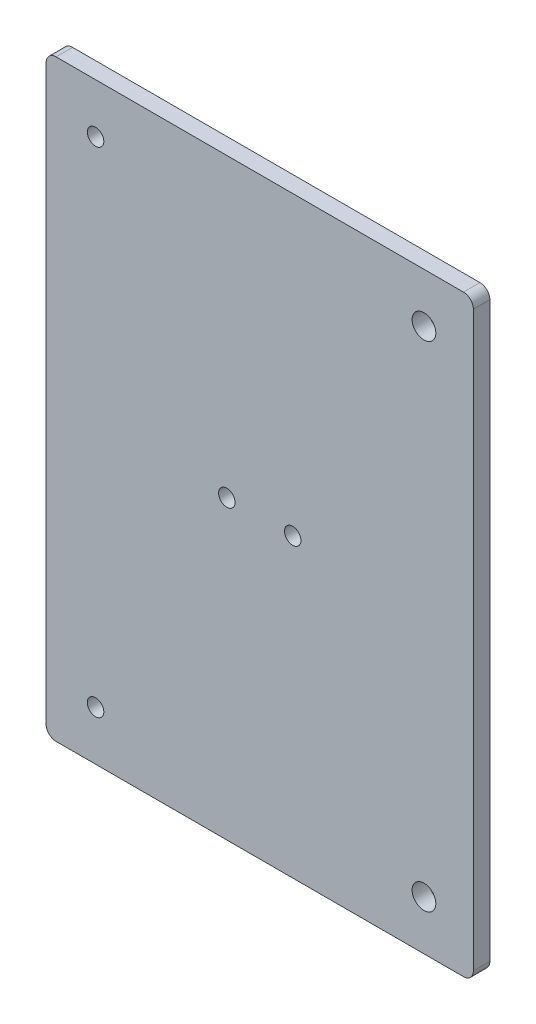
ISO-10303-21;
HEADER;
FILE_DESCRIPTION(('STEP AP214'),'2;1');
FILE_NAME('part.step','',(''),(''),'','','');
FILE_SCHEMA(('AUTOMOTIVE_DESIGN { 1 0 10303 214 1 1 1 1 }'));
ENDSEC;
DATA;
#1=APPLICATION_CONTEXT('core data for automotive mechanical design processes');
#2=APPLICATION_PROTOCOL_DEFINITION('international standard','automotive_design',2000,#1);
#3=PRODUCT_CONTEXT('',#1,'mechanical');
#4=PRODUCT('Part','Part','',(#3));
#5=PRODUCT_RELATED_PRODUCT_CATEGORY('part','',(#4));
#6=PRODUCT_DEFINITION_FORMATION('','',#4);
#7=PRODUCT_DEFINITION_CONTEXT('part definition',#1,'design');
#8=PRODUCT_DEFINITION('design','',#6,#7);
#9=PRODUCT_DEFINITION_SHAPE('','',#8);
#10=(LENGTH_UNIT() NAMED_UNIT(*) SI_UNIT(.MILLI.,.METRE.));
#11=(NAMED_UNIT(*) PLANE_ANGLE_UNIT() SI_UNIT($,.RADIAN.));
#12=(NAMED_UNIT(*) SI_UNIT($,.STERADIAN.) SOLID_ANGLE_UNIT());
#13=UNCERTAINTY_MEASURE_WITH_UNIT(LENGTH_MEASURE(1.E-05),#10,'distance_accuracy_value','');
#14=(GEOMETRIC_REPRESENTATION_CONTEXT(3) GLOBAL_UNCERTAINTY_ASSIGNED_CONTEXT((#13)) GLOBAL_UNIT_ASSIGNED_CONTEXT((#10,
#11,#12)) REPRESENTATION_CONTEXT('',''));
#15=CARTESIAN_POINT('',(0.,0.,0.));
#16=DIRECTION('',(0.,0.,1.));
#17=DIRECTION('',(1.,0.,0.));
#18=AXIS2_PLACEMENT_3D('',#15,#16,#17);
#19=CARTESIAN_POINT('',(0.,0.,5.));
#20=DIRECTION('',(0.,0.,-1.));
#21=DIRECTION('',(-1.,0.,0.));
#22=AXIS2_PLACEMENT_3D('',#19,#20,#21);
#23=PLANE('',#22);
#24=DIRECTION('',(0.,-1.,0.));
#25=VECTOR('',#24,1.);
#26=CARTESIAN_POINT('',(0.,0.,5.));
#27=LINE('',#26,#25);
#28=CARTESIAN_POINT('',(0.,177.,5.));
#29=VERTEX_POINT('',#28);
#30=CARTESIAN_POINT('',(0.,3.,5.));
#31=VERTEX_POINT('',#30);
#32=EDGE_CURVE('E149',#29,#31,#27,.T.);
#33=ORIENTED_EDGE('',*,*,#32,.T.);
#34=CARTESIAN_POINT('',(3.,3.,5.));
#35=DIRECTION('',(0.,0.,-1.));
#36=DIRECTION('',(-1.,0.,0.));
#37=AXIS2_PLACEMENT_3D('',#34,#35,#36);
#38=CIRCLE('',#37,3.);
#39=CARTESIAN_POINT('',(3.,0.,5.));
#40=VERTEX_POINT('',#39);
#41=EDGE_CURVE('E173',#31,#40,#38,.F.);
#42=ORIENTED_EDGE('',*,*,#41,.T.);
#43=DIRECTION('',(1.,0.,0.));
#44=VECTOR('',#43,1.);
#45=CARTESIAN_POINT('',(0.,0.,5.));
#46=LINE('',#45,#44);
#47=CARTESIAN_POINT('',(126.7,0.,5.));
#48=VERTEX_POINT('',#47);
#49=EDGE_CURVE('E126',#40,#48,#46,.T.);
#50=ORIENTED_EDGE('',*,*,#49,.T.);
#51=CARTESIAN_POINT('',(126.7,3.,5.));
#52=DIRECTION('',(0.,0.,-1.));
#53=DIRECTION('',(-1.,0.,0.));
#54=AXIS2_PLACEMENT_3D('',#51,#52,#53);
#55=CIRCLE('',#54,3.);
#56=CARTESIAN_POINT('',(129.7,3.,5.));
#57=VERTEX_POINT('',#56);
#58=EDGE_CURVE('E170',#48,#57,#55,.F.);
#59=ORIENTED_EDGE('',*,*,#58,.T.);
#60=DIRECTION('',(0.,1.,0.));
#61=VECTOR('',#60,1.);
#62=CARTESIAN_POINT('',(129.7,0.,5.));
#63=LINE('',#62,#61);
#64=CARTESIAN_POINT('',(129.7,177.,5.));
#65=VERTEX_POINT('',#64);
#66=EDGE_CURVE('E199',#57,#65,#63,.T.);
#67=ORIENTED_EDGE('',*,*,#66,.T.);
#68=CARTESIAN_POINT('',(126.7,177.,5.));
#69=DIRECTION('',(0.,0.,-1.));
#70=DIRECTION('',(-1.,0.,0.));
#71=AXIS2_PLACEMENT_3D('',#68,#69,#70);
#72=CIRCLE('',#71,3.);
#73=CARTESIAN_POINT('',(126.7,180.,5.));
#74=VERTEX_POINT('',#73);
#75=EDGE_CURVE('E60',#65,#74,#72,.F.);
#76=ORIENTED_EDGE('',*,*,#75,.T.);
#77=DIRECTION('',(-1.,0.,0.));
#78=VECTOR('',#77,1.);
#79=CARTESIAN_POINT('',(0.,180.,5.));
#80=LINE('',#79,#78);
#81=CARTESIAN_POINT('',(3.,180.,5.));
#82=VERTEX_POINT('',#81);
#83=EDGE_CURVE('E151',#74,#82,#80,.T.);
#84=ORIENTED_EDGE('',*,*,#83,.T.);
#85=CARTESIAN_POINT('',(3.,177.,5.));
#86=DIRECTION('',(0.,0.,-1.));
#87=DIRECTION('',(-1.,0.,0.));
#88=AXIS2_PLACEMENT_3D('',#85,#86,#87);
#89=CIRCLE('',#88,3.);
#90=EDGE_CURVE('E167',#82,#29,#89,.F.);
#91=ORIENTED_EDGE('',*,*,#90,.T.);
#92=EDGE_LOOP('',(#33,#42,#50,#59,#67,#76,#84,#91));
#93=FACE_BOUND('',#92,.T.);
#94=CARTESIAN_POINT('',(15.,15.,5.));
#95=DIRECTION('',(0.,0.,1.));
#96=DIRECTION('',(1.,0.,0.));
#97=AXIS2_PLACEMENT_3D('',#94,#95,#96);
#98=CIRCLE('',#97,2.5);
#99=CARTESIAN_POINT('',(17.5,15.,5.));
#100=VERTEX_POINT('',#99);
#101=EDGE_CURVE('E143',#100,#100,#98,.T.);
#102=ORIENTED_EDGE('',*,*,#101,.F.);
#103=EDGE_LOOP('',(#102));
#104=FACE_BOUND('',#103,.T.);
#105=CARTESIAN_POINT('',(15.,165.,5.));
#106=DIRECTION('',(0.,0.,1.));
#107=DIRECTION('',(1.,0.,0.));
#108=AXIS2_PLACEMENT_3D('',#105,#106,#107);
#109=CIRCLE('',#108,2.5);
#110=CARTESIAN_POINT('',(17.5,165.,5.));
#111=VERTEX_POINT('',#110);
#112=EDGE_CURVE('E216',#111,#111,#109,.T.);
#113=ORIENTED_EDGE('',*,*,#112,.F.);
#114=EDGE_LOOP('',(#113));
#115=FACE_BOUND('',#114,.T.);
#116=CARTESIAN_POINT('',(114.7,165.,5.));
#117=DIRECTION('',(0.,0.,1.));
#118=DIRECTION('',(1.,0.,0.));
#119=AXIS2_PLACEMENT_3D('',#116,#117,#118);
#120=CIRCLE('',#119,3.59999999999997);
#121=CARTESIAN_POINT('',(118.3,165.,5.));
#122=VERTEX_POINT('',#121);
#123=EDGE_CURVE('E220',#122,#122,#120,.T.);
#124=ORIENTED_EDGE('',*,*,#123,.F.);
#125=EDGE_LOOP('',(#124));
#126=FACE_BOUND('',#125,.T.);
#127=CARTESIAN_POINT('',(114.7,15.,5.));
#128=DIRECTION('',(0.,0.,1.));
#129=DIRECTION('',(1.,0.,0.));
#130=AXIS2_PLACEMENT_3D('',#127,#128,#129);
#131=CIRCLE('',#130,3.6);
#132=CARTESIAN_POINT('',(118.3,15.,5.));
#133=VERTEX_POINT('',#132);
#134=EDGE_CURVE('E224',#133,#133,#131,.T.);
#135=ORIENTED_EDGE('',*,*,#134,.F.);
#136=EDGE_LOOP('',(#135));
#137=FACE_BOUND('',#136,.T.);
#138=CARTESIAN_POINT('',(74.85,90.,5.));
#139=DIRECTION('',(0.,0.,1.));
#140=DIRECTION('',(1.,0.,0.));
#141=AXIS2_PLACEMENT_3D('',#138,#139,#140);
#142=CIRCLE('',#141,2.5);
#143=CARTESIAN_POINT('',(77.35,90.,5.));
#144=VERTEX_POINT('',#143);
#145=EDGE_CURVE('E228',#144,#144,#142,.T.);
#146=ORIENTED_EDGE('',*,*,#145,.F.);
#147=EDGE_LOOP('',(#146));
#148=FACE_BOUND('',#147,.T.);
#149=CARTESIAN_POINT('',(54.85,90.,5.));
#150=DIRECTION('',(0.,0.,1.));
#151=DIRECTION('',(1.,0.,0.));
#152=AXIS2_PLACEMENT_3D('',#149,#150,#151);
#153=CIRCLE('',#152,2.5);
#154=CARTESIAN_POINT('',(57.35,90.,5.));
#155=VERTEX_POINT('',#154);
#156=EDGE_CURVE('E231',#155,#155,#153,.T.);
#157=ORIENTED_EDGE('',*,*,#156,.F.);
#158=EDGE_LOOP('',(#157));
#159=FACE_BOUND('',#158,.T.);
#160=ADVANCED_FACE('F39',(#93,#104,#115,#126,#137,#148,#159),#23,.F.);
#161=CARTESIAN_POINT('',(0.,0.,0.));
#162=DIRECTION('',(0.,0.,-1.));
#163=DIRECTION('',(-1.,0.,0.));
#164=AXIS2_PLACEMENT_3D('',#161,#162,#163);
#165=PLANE('',#164);
#166=CARTESIAN_POINT('',(74.85,90.,0.));
#167=DIRECTION('',(0.,0.,1.));
#168=DIRECTION('',(1.,0.,0.));
#169=AXIS2_PLACEMENT_3D('',#166,#167,#168);
#170=CIRCLE('',#169,2.5);
#171=CARTESIAN_POINT('',(77.35,90.,0.));
#172=VERTEX_POINT('',#171);
#173=EDGE_CURVE('E234',#172,#172,#170,.T.);
#174=ORIENTED_EDGE('',*,*,#173,.T.);
#175=EDGE_LOOP('',(#174));
#176=FACE_BOUND('',#175,.T.);
#177=CARTESIAN_POINT('',(114.7,165.,0.));
#178=DIRECTION('',(0.,0.,1.));
#179=DIRECTION('',(1.,0.,0.));
#180=AXIS2_PLACEMENT_3D('',#177,#178,#179);
#181=CIRCLE('',#180,3.59999999999997);
#182=CARTESIAN_POINT('',(118.3,165.,0.));
#183=VERTEX_POINT('',#182);
#184=EDGE_CURVE('E249',#183,#183,#181,.T.);
#185=ORIENTED_EDGE('',*,*,#184,.T.);
#186=EDGE_LOOP('',(#185));
#187=FACE_BOUND('',#186,.T.);
#188=CARTESIAN_POINT('',(15.,15.,0.));
#189=DIRECTION('',(0.,0.,1.));
#190=DIRECTION('',(1.,0.,0.));
#191=AXIS2_PLACEMENT_3D('',#188,#189,#190);
#192=CIRCLE('',#191,2.5);
#193=CARTESIAN_POINT('',(17.5,15.,0.));
#194=VERTEX_POINT('',#193);
#195=EDGE_CURVE('E202',#194,#194,#192,.T.);
#196=ORIENTED_EDGE('',*,*,#195,.T.);
#197=EDGE_LOOP('',(#196));
#198=FACE_BOUND('',#197,.T.);
#199=DIRECTION('',(1.,0.,0.));
#200=VECTOR('',#199,1.);
#201=CARTESIAN_POINT('',(0.,0.,0.));
#202=LINE('',#201,#200);
#203=CARTESIAN_POINT('',(3.,0.,0.));
#204=VERTEX_POINT('',#203);
#205=CARTESIAN_POINT('',(126.7,0.,0.));
#206=VERTEX_POINT('',#205);
#207=EDGE_CURVE('E123',#204,#206,#202,.T.);
#208=ORIENTED_EDGE('',*,*,#207,.F.);
#209=CARTESIAN_POINT('',(3.,3.,0.));
#210=DIRECTION('',(0.,0.,-1.));
#211=DIRECTION('',(-1.,0.,0.));
#212=AXIS2_PLACEMENT_3D('',#209,#210,#211);
#213=CIRCLE('',#212,3.);
#214=CARTESIAN_POINT('',(0.,3.,0.));
#215=VERTEX_POINT('',#214);
#216=EDGE_CURVE('E105',#204,#215,#213,.T.);
#217=ORIENTED_EDGE('',*,*,#216,.T.);
#218=DIRECTION('',(0.,-1.,0.));
#219=VECTOR('',#218,1.);
#220=CARTESIAN_POINT('',(0.,0.,0.));
#221=LINE('',#220,#219);
#222=CARTESIAN_POINT('',(0.,177.,0.));
#223=VERTEX_POINT('',#222);
#224=EDGE_CURVE('E136',#223,#215,#221,.T.);
#225=ORIENTED_EDGE('',*,*,#224,.F.);
#226=CARTESIAN_POINT('',(3.,177.,0.));
#227=DIRECTION('',(0.,0.,-1.));
#228=DIRECTION('',(-1.,0.,0.));
#229=AXIS2_PLACEMENT_3D('',#226,#227,#228);
#230=CIRCLE('',#229,3.);
#231=CARTESIAN_POINT('',(3.,180.,0.));
#232=VERTEX_POINT('',#231);
#233=EDGE_CURVE('E155',#223,#232,#230,.T.);
#234=ORIENTED_EDGE('',*,*,#233,.T.);
#235=DIRECTION('',(-1.,0.,0.));
#236=VECTOR('',#235,1.);
#237=CARTESIAN_POINT('',(0.,180.,0.));
#238=LINE('',#237,#236);
#239=CARTESIAN_POINT('',(126.7,180.,0.));
#240=VERTEX_POINT('',#239);
#241=EDGE_CURVE('E141',#240,#232,#238,.T.);
#242=ORIENTED_EDGE('',*,*,#241,.F.);
#243=CARTESIAN_POINT('',(126.7,177.,0.));
#244=DIRECTION('',(0.,0.,-1.));
#245=DIRECTION('',(-1.,0.,0.));
#246=AXIS2_PLACEMENT_3D('',#243,#244,#245);
#247=CIRCLE('',#246,3.);
#248=CARTESIAN_POINT('',(129.7,177.,0.));
#249=VERTEX_POINT('',#248);
#250=EDGE_CURVE('E128',#240,#249,#247,.T.);
#251=ORIENTED_EDGE('',*,*,#250,.T.);
#252=DIRECTION('',(0.,1.,0.));
#253=VECTOR('',#252,1.);
#254=CARTESIAN_POINT('',(129.7,0.,0.));
#255=LINE('',#254,#253);
#256=CARTESIAN_POINT('',(129.7,3.,0.));
#257=VERTEX_POINT('',#256);
#258=EDGE_CURVE('E135',#257,#249,#255,.T.);
#259=ORIENTED_EDGE('',*,*,#258,.F.);
#260=CARTESIAN_POINT('',(126.7,3.,0.));
#261=DIRECTION('',(0.,0.,-1.));
#262=DIRECTION('',(-1.,0.,0.));
#263=AXIS2_PLACEMENT_3D('',#260,#261,#262);
#264=CIRCLE('',#263,3.);
#265=EDGE_CURVE('E117',#257,#206,#264,.T.);
#266=ORIENTED_EDGE('',*,*,#265,.T.);
#267=EDGE_LOOP('',(#208,#217,#225,#234,#242,#251,#259,#266));
#268=FACE_BOUND('',#267,.T.);
#269=CARTESIAN_POINT('',(15.,165.,0.));
#270=DIRECTION('',(0.,0.,1.));
#271=DIRECTION('',(1.,0.,0.));
#272=AXIS2_PLACEMENT_3D('',#269,#270,#271);
#273=CIRCLE('',#272,2.5);
#274=CARTESIAN_POINT('',(17.5,165.,0.));
#275=VERTEX_POINT('',#274);
#276=EDGE_CURVE('E255',#275,#275,#273,.T.);
#277=ORIENTED_EDGE('',*,*,#276,.T.);
#278=EDGE_LOOP('',(#277));
#279=FACE_BOUND('',#278,.T.);
#280=CARTESIAN_POINT('',(114.7,15.,0.));
#281=DIRECTION('',(0.,0.,1.));
#282=DIRECTION('',(1.,0.,0.));
#283=AXIS2_PLACEMENT_3D('',#280,#281,#282);
#284=CIRCLE('',#283,3.6);
#285=CARTESIAN_POINT('',(118.3,15.,0.));
#286=VERTEX_POINT('',#285);
#287=EDGE_CURVE('E245',#286,#286,#284,.T.);
#288=ORIENTED_EDGE('',*,*,#287,.T.);
#289=EDGE_LOOP('',(#288));
#290=FACE_BOUND('',#289,.T.);
#291=CARTESIAN_POINT('',(54.85,90.,0.));
#292=DIRECTION('',(0.,0.,1.));
#293=DIRECTION('',(1.,0.,0.));
#294=AXIS2_PLACEMENT_3D('',#291,#292,#293);
#295=CIRCLE('',#294,2.5);
#296=CARTESIAN_POINT('',(57.35,90.,0.));
#297=VERTEX_POINT('',#296);
#298=EDGE_CURVE('E235',#297,#297,#295,.T.);
#299=ORIENTED_EDGE('',*,*,#298,.T.);
#300=EDGE_LOOP('',(#299));
#301=FACE_BOUND('',#300,.T.);
#302=ADVANCED_FACE('F131',(#176,#187,#198,#268,#279,#290,#301),#165,.T.);
#303=CARTESIAN_POINT('',(0.,0.,5.));
#304=DIRECTION('',(1.,0.,0.));
#305=DIRECTION('',(0.,0.,-1.));
#306=AXIS2_PLACEMENT_3D('',#303,#304,#305);
#307=PLANE('',#306);
#308=ORIENTED_EDGE('',*,*,#224,.T.);
#309=DIRECTION('',(0.,0.,-1.));
#310=VECTOR('',#309,1.);
#311=CARTESIAN_POINT('',(0.,3.,5.));
#312=LINE('',#311,#310);
#313=EDGE_CURVE('E110',#215,#31,#312,.F.);
#314=ORIENTED_EDGE('',*,*,#313,.T.);
#315=ORIENTED_EDGE('',*,*,#32,.F.);
#316=DIRECTION('',(0.,0.,-1.));
#317=VECTOR('',#316,1.);
#318=CARTESIAN_POINT('',(0.,177.,5.));
#319=LINE('',#318,#317);
#320=EDGE_CURVE('E116',#29,#223,#319,.T.);
#321=ORIENTED_EDGE('',*,*,#320,.T.);
#322=EDGE_LOOP('',(#308,#314,#315,#321));
#323=FACE_BOUND('',#322,.T.);
#324=ADVANCED_FACE('F194',(#323),#307,.F.);
#325=CARTESIAN_POINT('',(0.,0.,5.));
#326=DIRECTION('',(0.,1.,0.));
#327=DIRECTION('',(0.,0.,1.));
#328=AXIS2_PLACEMENT_3D('',#325,#326,#327);
#329=PLANE('',#328);
#330=ORIENTED_EDGE('',*,*,#49,.F.);
#331=DIRECTION('',(0.,0.,-1.));
#332=VECTOR('',#331,1.);
#333=CARTESIAN_POINT('',(3.,0.,5.));
#334=LINE('',#333,#332);
#335=EDGE_CURVE('E109',#40,#204,#334,.T.);
#336=ORIENTED_EDGE('',*,*,#335,.T.);
#337=ORIENTED_EDGE('',*,*,#207,.T.);
#338=DIRECTION('',(0.,0.,-1.));
#339=VECTOR('',#338,1.);
#340=CARTESIAN_POINT('',(126.7,0.,5.));
#341=LINE('',#340,#339);
#342=EDGE_CURVE('E129',#206,#48,#341,.F.);
#343=ORIENTED_EDGE('',*,*,#342,.T.);
#344=EDGE_LOOP('',(#330,#336,#337,#343));
#345=FACE_BOUND('',#344,.T.);
#346=ADVANCED_FACE('F122',(#345),#329,.F.);
#347=CARTESIAN_POINT('',(129.7,0.,5.));
#348=DIRECTION('',(-1.,0.,0.));
#349=DIRECTION('',(0.,0.,1.));
#350=AXIS2_PLACEMENT_3D('',#347,#348,#349);
#351=PLANE('',#350);
#352=ORIENTED_EDGE('',*,*,#66,.F.);
#353=DIRECTION('',(0.,0.,-1.));
#354=VECTOR('',#353,1.);
#355=CARTESIAN_POINT('',(129.7,3.,5.));
#356=LINE('',#355,#354);
#357=EDGE_CURVE('E179',#57,#257,#356,.T.);
#358=ORIENTED_EDGE('',*,*,#357,.T.);
#359=ORIENTED_EDGE('',*,*,#258,.T.);
#360=DIRECTION('',(0.,0.,-1.));
#361=VECTOR('',#360,1.);
#362=CARTESIAN_POINT('',(129.7,177.,5.));
#363=LINE('',#362,#361);
#364=EDGE_CURVE('E176',#249,#65,#363,.F.);
#365=ORIENTED_EDGE('',*,*,#364,.T.);
#366=EDGE_LOOP('',(#352,#358,#359,#365));
#367=FACE_BOUND('',#366,.T.);
#368=ADVANCED_FACE('F281',(#367),#351,.F.);
#369=CARTESIAN_POINT('',(0.,180.,5.));
#370=DIRECTION('',(0.,-1.,0.));
#371=DIRECTION('',(0.,0.,-1.));
#372=AXIS2_PLACEMENT_3D('',#369,#370,#371);
#373=PLANE('',#372);
#374=ORIENTED_EDGE('',*,*,#241,.T.);
#375=DIRECTION('',(0.,0.,-1.));
#376=VECTOR('',#375,1.);
#377=CARTESIAN_POINT('',(3.,180.,5.));
#378=LINE('',#377,#376);
#379=EDGE_CURVE('E11',#232,#82,#378,.F.);
#380=ORIENTED_EDGE('',*,*,#379,.T.);
#381=ORIENTED_EDGE('',*,*,#83,.F.);
#382=DIRECTION('',(0.,0.,-1.));
#383=VECTOR('',#382,1.);
#384=CARTESIAN_POINT('',(126.7,180.,5.));
#385=LINE('',#384,#383);
#386=EDGE_CURVE('E48',#74,#240,#385,.T.);
#387=ORIENTED_EDGE('',*,*,#386,.T.);
#388=EDGE_LOOP('',(#374,#380,#381,#387));
#389=FACE_BOUND('',#388,.T.);
#390=ADVANCED_FACE('F186',(#389),#373,.F.);
#391=CARTESIAN_POINT('',(15.,15.,5.));
#392=DIRECTION('',(0.,0.,-1.));
#393=DIRECTION('',(-1.,0.,0.));
#394=AXIS2_PLACEMENT_3D('',#391,#392,#393);
#395=CYLINDRICAL_SURFACE('',#394,2.5);
#396=ORIENTED_EDGE('',*,*,#101,.T.);
#397=EDGE_LOOP('',(#396));
#398=FACE_BOUND('',#397,.T.);
#399=ORIENTED_EDGE('',*,*,#195,.F.);
#400=EDGE_LOOP('',(#399));
#401=FACE_BOUND('',#400,.T.);
#402=ADVANCED_FACE('F270',(#398,#401),#395,.F.);
#403=CARTESIAN_POINT('',(15.,165.,5.));
#404=DIRECTION('',(0.,0.,-1.));
#405=DIRECTION('',(-1.,0.,0.));
#406=AXIS2_PLACEMENT_3D('',#403,#404,#405);
#407=CYLINDRICAL_SURFACE('',#406,2.5);
#408=ORIENTED_EDGE('',*,*,#112,.T.);
#409=EDGE_LOOP('',(#408));
#410=FACE_BOUND('',#409,.T.);
#411=ORIENTED_EDGE('',*,*,#276,.F.);
#412=EDGE_LOOP('',(#411));
#413=FACE_BOUND('',#412,.T.);
#414=ADVANCED_FACE('F272',(#410,#413),#407,.F.);
#415=CARTESIAN_POINT('',(114.7,165.,5.));
#416=DIRECTION('',(0.,0.,-1.));
#417=DIRECTION('',(-1.,0.,0.));
#418=AXIS2_PLACEMENT_3D('',#415,#416,#417);
#419=CYLINDRICAL_SURFACE('',#418,3.59999999999997);
#420=ORIENTED_EDGE('',*,*,#123,.T.);
#421=EDGE_LOOP('',(#420));
#422=FACE_BOUND('',#421,.T.);
#423=ORIENTED_EDGE('',*,*,#184,.F.);
#424=EDGE_LOOP('',(#423));
#425=FACE_BOUND('',#424,.T.);
#426=ADVANCED_FACE('F278',(#422,#425),#419,.F.);
#427=CARTESIAN_POINT('',(114.7,15.,5.));
#428=DIRECTION('',(0.,0.,-1.));
#429=DIRECTION('',(-1.,0.,0.));
#430=AXIS2_PLACEMENT_3D('',#427,#428,#429);
#431=CYLINDRICAL_SURFACE('',#430,3.6);
#432=ORIENTED_EDGE('',*,*,#134,.T.);
#433=EDGE_LOOP('',(#432));
#434=FACE_BOUND('',#433,.T.);
#435=ORIENTED_EDGE('',*,*,#287,.F.);
#436=EDGE_LOOP('',(#435));
#437=FACE_BOUND('',#436,.T.);
#438=ADVANCED_FACE('F382',(#434,#437),#431,.F.);
#439=CARTESIAN_POINT('',(74.85,90.,5.));
#440=DIRECTION('',(0.,0.,-1.));
#441=DIRECTION('',(-1.,0.,0.));
#442=AXIS2_PLACEMENT_3D('',#439,#440,#441);
#443=CYLINDRICAL_SURFACE('',#442,2.5);
#444=ORIENTED_EDGE('',*,*,#145,.T.);
#445=EDGE_LOOP('',(#444));
#446=FACE_BOUND('',#445,.T.);
#447=ORIENTED_EDGE('',*,*,#173,.F.);
#448=EDGE_LOOP('',(#447));
#449=FACE_BOUND('',#448,.T.);
#450=ADVANCED_FACE('F373',(#446,#449),#443,.F.);
#451=CARTESIAN_POINT('',(54.85,90.,5.));
#452=DIRECTION('',(0.,0.,-1.));
#453=DIRECTION('',(-1.,0.,0.));
#454=AXIS2_PLACEMENT_3D('',#451,#452,#453);
#455=CYLINDRICAL_SURFACE('',#454,2.5);
#456=ORIENTED_EDGE('',*,*,#156,.T.);
#457=EDGE_LOOP('',(#456));
#458=FACE_BOUND('',#457,.T.);
#459=ORIENTED_EDGE('',*,*,#298,.F.);
#460=EDGE_LOOP('',(#459));
#461=FACE_BOUND('',#460,.T.);
#462=ADVANCED_FACE('F298',(#458,#461),#455,.F.);
#463=CARTESIAN_POINT('',(3.,3.,5.));
#464=DIRECTION('',(0.,0.,-1.));
#465=DIRECTION('',(-1.,0.,0.));
#466=AXIS2_PLACEMENT_3D('',#463,#464,#465);
#467=CYLINDRICAL_SURFACE('',#466,3.);
#468=ORIENTED_EDGE('',*,*,#41,.F.);
#469=ORIENTED_EDGE('',*,*,#313,.F.);
#470=ORIENTED_EDGE('',*,*,#216,.F.);
#471=ORIENTED_EDGE('',*,*,#335,.F.);
#472=EDGE_LOOP('',(#468,#469,#470,#471));
#473=FACE_BOUND('',#472,.T.);
#474=ADVANCED_FACE('F108',(#473),#467,.T.);
#475=CARTESIAN_POINT('',(126.7,3.,5.));
#476=DIRECTION('',(0.,0.,-1.));
#477=DIRECTION('',(-1.,0.,0.));
#478=AXIS2_PLACEMENT_3D('',#475,#476,#477);
#479=CYLINDRICAL_SURFACE('',#478,3.);
#480=ORIENTED_EDGE('',*,*,#58,.F.);
#481=ORIENTED_EDGE('',*,*,#342,.F.);
#482=ORIENTED_EDGE('',*,*,#265,.F.);
#483=ORIENTED_EDGE('',*,*,#357,.F.);
#484=EDGE_LOOP('',(#480,#481,#482,#483));
#485=FACE_BOUND('',#484,.T.);
#486=ADVANCED_FACE('F297',(#485),#479,.T.);
#487=CARTESIAN_POINT('',(3.,177.,5.));
#488=DIRECTION('',(0.,0.,-1.));
#489=DIRECTION('',(-1.,0.,0.));
#490=AXIS2_PLACEMENT_3D('',#487,#488,#489);
#491=CYLINDRICAL_SURFACE('',#490,3.);
#492=ORIENTED_EDGE('',*,*,#90,.F.);
#493=ORIENTED_EDGE('',*,*,#379,.F.);
#494=ORIENTED_EDGE('',*,*,#233,.F.);
#495=ORIENTED_EDGE('',*,*,#320,.F.);
#496=EDGE_LOOP('',(#492,#493,#494,#495));
#497=FACE_BOUND('',#496,.T.);
#498=ADVANCED_FACE('F191',(#497),#491,.T.);
#499=CARTESIAN_POINT('',(126.7,177.,5.));
#500=DIRECTION('',(0.,0.,-1.));
#501=DIRECTION('',(-1.,0.,0.));
#502=AXIS2_PLACEMENT_3D('',#499,#500,#501);
#503=CYLINDRICAL_SURFACE('',#502,3.);
#504=ORIENTED_EDGE('',*,*,#75,.F.);
#505=ORIENTED_EDGE('',*,*,#364,.F.);
#506=ORIENTED_EDGE('',*,*,#250,.F.);
#507=ORIENTED_EDGE('',*,*,#386,.F.);
#508=EDGE_LOOP('',(#504,#505,#506,#507));
#509=FACE_BOUND('',#508,.T.);
#510=ADVANCED_FACE('F41',(#509),#503,.T.);
#511=CLOSED_SHELL('',(#160,#302,#324,#346,#368,#390,#402,#414,#426,#438,#450,#462,#474,#486,
#498,#510));
#512=MANIFOLD_SOLID_BREP('B2',#511);
#513=ADVANCED_BREP_SHAPE_REPRESENTATION('',(#18,#512),#14);
#514=SHAPE_DEFINITION_REPRESENTATION(#9,#513);
ENDSEC;
END-ISO-10303-21;
